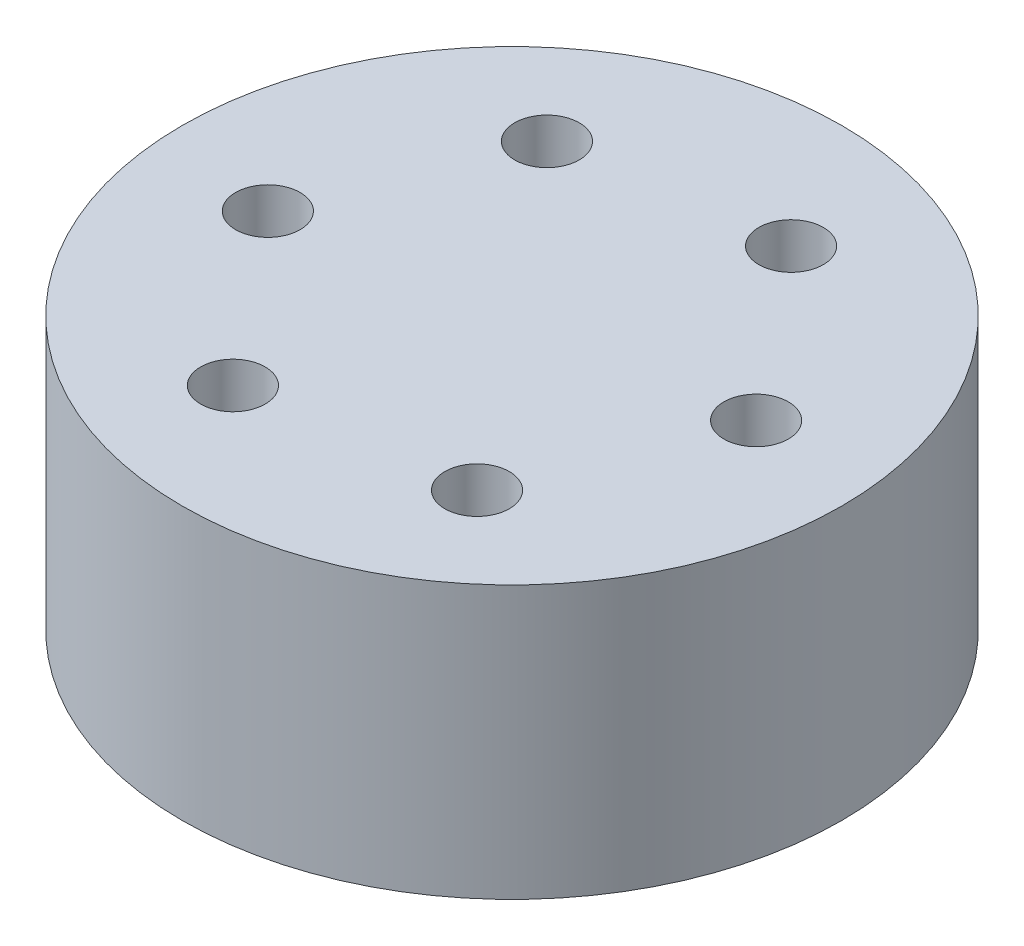
ISO-10303-21;
HEADER;
FILE_DESCRIPTION(('STEP AP214'),'2;1');
FILE_NAME('part.step','',(''),(''),'','','');
FILE_SCHEMA(('AUTOMOTIVE_DESIGN { 1 0 10303 214 1 1 1 1 }'));
ENDSEC;
DATA;
#1=APPLICATION_CONTEXT('core data for automotive mechanical design processes');
#2=APPLICATION_PROTOCOL_DEFINITION('international standard','automotive_design',2000,#1);
#3=PRODUCT_CONTEXT('',#1,'mechanical');
#4=PRODUCT('Part','Part','',(#3));
#5=PRODUCT_RELATED_PRODUCT_CATEGORY('part','',(#4));
#6=PRODUCT_DEFINITION_FORMATION('','',#4);
#7=PRODUCT_DEFINITION_CONTEXT('part definition',#1,'design');
#8=PRODUCT_DEFINITION('design','',#6,#7);
#9=PRODUCT_DEFINITION_SHAPE('','',#8);
#10=(LENGTH_UNIT() NAMED_UNIT(*) SI_UNIT(.MILLI.,.METRE.));
#11=(NAMED_UNIT(*) PLANE_ANGLE_UNIT() SI_UNIT($,.RADIAN.));
#12=(NAMED_UNIT(*) SI_UNIT($,.STERADIAN.) SOLID_ANGLE_UNIT());
#13=UNCERTAINTY_MEASURE_WITH_UNIT(LENGTH_MEASURE(1.E-05),#10,'distance_accuracy_value','');
#14=(GEOMETRIC_REPRESENTATION_CONTEXT(3) GLOBAL_UNCERTAINTY_ASSIGNED_CONTEXT((#13)) GLOBAL_UNIT_ASSIGNED_CONTEXT((#10,
#11,#12)) REPRESENTATION_CONTEXT('',''));
#15=CARTESIAN_POINT('',(0.,0.,0.));
#16=DIRECTION('',(0.,0.,1.));
#17=DIRECTION('',(1.,0.,0.));
#18=AXIS2_PLACEMENT_3D('',#15,#16,#17);
#19=CARTESIAN_POINT('',(0.,46.75,170.));
#20=DIRECTION('',(0.,-1.,0.));
#21=DIRECTION('',(0.,0.,-1.));
#22=AXIS2_PLACEMENT_3D('',#19,#20,#21);
#23=CYLINDRICAL_SURFACE('',#22,23.);
#24=CARTESIAN_POINT('',(0.,46.75,170.));
#25=DIRECTION('',(0.,1.,0.));
#26=DIRECTION('',(0.,0.,1.));
#27=AXIS2_PLACEMENT_3D('',#24,#25,#26);
#28=CIRCLE('',#27,23.);
#29=CARTESIAN_POINT('',(0.,46.75,193.));
#30=VERTEX_POINT('',#29);
#31=EDGE_CURVE('E10',#30,#30,#28,.T.);
#32=ORIENTED_EDGE('',*,*,#31,.F.);
#33=EDGE_LOOP('',(#32));
#34=FACE_BOUND('',#33,.T.);
#35=CARTESIAN_POINT('',(0.,27.75,170.));
#36=DIRECTION('',(0.,1.,0.));
#37=DIRECTION('',(0.,0.,1.));
#38=AXIS2_PLACEMENT_3D('',#35,#36,#37);
#39=CIRCLE('',#38,23.);
#40=CARTESIAN_POINT('',(0.,27.75,193.));
#41=VERTEX_POINT('',#40);
#42=EDGE_CURVE('E42',#41,#41,#39,.T.);
#43=ORIENTED_EDGE('',*,*,#42,.T.);
#44=EDGE_LOOP('',(#43));
#45=FACE_BOUND('',#44,.T.);
#46=ADVANCED_FACE('F40',(#34,#45),#23,.T.);
#47=CARTESIAN_POINT('',(0.,46.75,170.));
#48=DIRECTION('',(0.,1.,0.));
#49=DIRECTION('',(0.,0.,1.));
#50=AXIS2_PLACEMENT_3D('',#47,#48,#49);
#51=PLANE('',#50);
#52=CARTESIAN_POINT('',(14.8390849944448,46.75,167.808754571564));
#53=DIRECTION('',(0.,1.,0.));
#54=DIRECTION('',(0.,0.,1.));
#55=AXIS2_PLACEMENT_3D('',#52,#53,#54);
#56=CIRCLE('',#55,2.25);
#57=CARTESIAN_POINT('',(14.8390849944448,46.75,170.058754571564));
#58=VERTEX_POINT('',#57);
#59=EDGE_CURVE('E47',#58,#58,#56,.T.);
#60=ORIENTED_EDGE('',*,*,#59,.F.);
#61=EDGE_LOOP('',(#60));
#62=FACE_BOUND('',#61,.T.);
#63=CARTESIAN_POINT('',(5.52186829027017,46.75,156.053352711676));
#64=DIRECTION('',(0.,1.,0.));
#65=DIRECTION('',(0.,0.,1.));
#66=AXIS2_PLACEMENT_3D('',#63,#64,#65);
#67=CIRCLE('',#66,2.25);
#68=CARTESIAN_POINT('',(5.52186829027017,46.75,158.303352711676));
#69=VERTEX_POINT('',#68);
#70=EDGE_CURVE('E92',#69,#69,#67,.T.);
#71=ORIENTED_EDGE('',*,*,#70,.F.);
#72=EDGE_LOOP('',(#71));
#73=FACE_BOUND('',#72,.T.);
#74=CARTESIAN_POINT('',(-9.31721670417466,46.75,158.244598140112));
#75=DIRECTION('',(0.,1.,0.));
#76=DIRECTION('',(0.,0.,1.));
#77=AXIS2_PLACEMENT_3D('',#74,#75,#76);
#78=CIRCLE('',#77,2.25);
#79=CARTESIAN_POINT('',(-9.31721670417466,46.75,160.494598140112));
#80=VERTEX_POINT('',#79);
#81=EDGE_CURVE('E55',#80,#80,#78,.T.);
#82=ORIENTED_EDGE('',*,*,#81,.F.);
#83=EDGE_LOOP('',(#82));
#84=FACE_BOUND('',#83,.T.);
#85=CARTESIAN_POINT('',(-14.8390849944448,46.75,172.191245428436));
#86=DIRECTION('',(0.,1.,0.));
#87=DIRECTION('',(0.,0.,1.));
#88=AXIS2_PLACEMENT_3D('',#85,#86,#87);
#89=CIRCLE('',#88,2.25);
#90=CARTESIAN_POINT('',(-14.8390849944448,46.75,174.441245428436));
#91=VERTEX_POINT('',#90);
#92=EDGE_CURVE('E101',#91,#91,#89,.T.);
#93=ORIENTED_EDGE('',*,*,#92,.F.);
#94=EDGE_LOOP('',(#93));
#95=FACE_BOUND('',#94,.T.);
#96=CARTESIAN_POINT('',(-5.52186829027017,46.75,183.946647288324));
#97=DIRECTION('',(0.,1.,0.));
#98=DIRECTION('',(0.,0.,1.));
#99=AXIS2_PLACEMENT_3D('',#96,#97,#98);
#100=CIRCLE('',#99,2.25);
#101=CARTESIAN_POINT('',(-5.52186829027017,46.75,186.196647288324));
#102=VERTEX_POINT('',#101);
#103=EDGE_CURVE('E103',#102,#102,#100,.T.);
#104=ORIENTED_EDGE('',*,*,#103,.F.);
#105=EDGE_LOOP('',(#104));
#106=FACE_BOUND('',#105,.T.);
#107=CARTESIAN_POINT('',(9.31721670417466,46.75,181.755401859888));
#108=DIRECTION('',(0.,1.,0.));
#109=DIRECTION('',(0.,0.,1.));
#110=AXIS2_PLACEMENT_3D('',#107,#108,#109);
#111=CIRCLE('',#110,2.25);
#112=CARTESIAN_POINT('',(9.31721670417466,46.75,184.005401859888));
#113=VERTEX_POINT('',#112);
#114=EDGE_CURVE('E98',#113,#113,#111,.T.);
#115=ORIENTED_EDGE('',*,*,#114,.F.);
#116=EDGE_LOOP('',(#115));
#117=FACE_BOUND('',#116,.T.);
#118=ORIENTED_EDGE('',*,*,#31,.T.);
#119=EDGE_LOOP('',(#118));
#120=FACE_BOUND('',#119,.T.);
#121=ADVANCED_FACE('F115',(#62,#73,#84,#95,#106,#117,#120),#51,.T.);
#122=CARTESIAN_POINT('',(0.,27.75,170.));
#123=DIRECTION('',(0.,1.,0.));
#124=DIRECTION('',(0.,0.,1.));
#125=AXIS2_PLACEMENT_3D('',#122,#123,#124);
#126=PLANE('',#125);
#127=CARTESIAN_POINT('',(0.,27.75,170.));
#128=DIRECTION('',(0.,1.,0.));
#129=DIRECTION('',(0.,0.,1.));
#130=AXIS2_PLACEMENT_3D('',#127,#128,#129);
#131=CIRCLE('',#130,21.2);
#132=CARTESIAN_POINT('',(0.,27.75,191.2));
#133=VERTEX_POINT('',#132);
#134=EDGE_CURVE('E67',#133,#133,#131,.T.);
#135=ORIENTED_EDGE('',*,*,#134,.T.);
#136=EDGE_LOOP('',(#135));
#137=FACE_BOUND('',#136,.T.);
#138=ORIENTED_EDGE('',*,*,#42,.F.);
#139=EDGE_LOOP('',(#138));
#140=FACE_BOUND('',#139,.T.);
#141=ADVANCED_FACE('F114',(#137,#140),#126,.F.);
#142=CARTESIAN_POINT('',(9.31721670417466,46.75,181.755401859888));
#143=DIRECTION('',(0.,-1.,0.));
#144=DIRECTION('',(0.,0.,-1.));
#145=AXIS2_PLACEMENT_3D('',#142,#143,#144);
#146=CYLINDRICAL_SURFACE('',#145,2.25);
#147=CARTESIAN_POINT('',(9.31721670417466,28.95,181.755401859888));
#148=DIRECTION('',(0.,1.,0.));
#149=DIRECTION('',(0.,0.,1.));
#150=AXIS2_PLACEMENT_3D('',#147,#148,#149);
#151=CIRCLE('',#150,2.25);
#152=CARTESIAN_POINT('',(9.31721670417466,28.95,184.005401859888));
#153=VERTEX_POINT('',#152);
#154=EDGE_CURVE('E89',#153,#153,#151,.T.);
#155=ORIENTED_EDGE('',*,*,#154,.F.);
#156=EDGE_LOOP('',(#155));
#157=FACE_BOUND('',#156,.T.);
#158=ORIENTED_EDGE('',*,*,#114,.T.);
#159=EDGE_LOOP('',(#158));
#160=FACE_BOUND('',#159,.T.);
#161=ADVANCED_FACE('F124',(#157,#160),#146,.F.);
#162=CARTESIAN_POINT('',(-5.52186829027017,46.75,183.946647288324));
#163=DIRECTION('',(0.,-1.,0.));
#164=DIRECTION('',(0.,0.,-1.));
#165=AXIS2_PLACEMENT_3D('',#162,#163,#164);
#166=CYLINDRICAL_SURFACE('',#165,2.25);
#167=CARTESIAN_POINT('',(-5.52186829027017,28.95,183.946647288324));
#168=DIRECTION('',(0.,1.,0.));
#169=DIRECTION('',(0.,0.,1.));
#170=AXIS2_PLACEMENT_3D('',#167,#168,#169);
#171=CIRCLE('',#170,2.25);
#172=CARTESIAN_POINT('',(-5.52186829027017,28.95,186.196647288324));
#173=VERTEX_POINT('',#172);
#174=EDGE_CURVE('E90',#173,#173,#171,.T.);
#175=ORIENTED_EDGE('',*,*,#174,.F.);
#176=EDGE_LOOP('',(#175));
#177=FACE_BOUND('',#176,.T.);
#178=ORIENTED_EDGE('',*,*,#103,.T.);
#179=EDGE_LOOP('',(#178));
#180=FACE_BOUND('',#179,.T.);
#181=ADVANCED_FACE('F123',(#177,#180),#166,.F.);
#182=CARTESIAN_POINT('',(-14.8390849944448,46.75,172.191245428436));
#183=DIRECTION('',(0.,-1.,0.));
#184=DIRECTION('',(0.,0.,-1.));
#185=AXIS2_PLACEMENT_3D('',#182,#183,#184);
#186=CYLINDRICAL_SURFACE('',#185,2.25);
#187=CARTESIAN_POINT('',(-14.8390849944448,28.95,172.191245428436));
#188=DIRECTION('',(0.,1.,0.));
#189=DIRECTION('',(0.,0.,1.));
#190=AXIS2_PLACEMENT_3D('',#187,#188,#189);
#191=CIRCLE('',#190,2.25);
#192=CARTESIAN_POINT('',(-14.8390849944448,28.95,174.441245428436));
#193=VERTEX_POINT('',#192);
#194=EDGE_CURVE('E81',#193,#193,#191,.T.);
#195=ORIENTED_EDGE('',*,*,#194,.F.);
#196=EDGE_LOOP('',(#195));
#197=FACE_BOUND('',#196,.T.);
#198=ORIENTED_EDGE('',*,*,#92,.T.);
#199=EDGE_LOOP('',(#198));
#200=FACE_BOUND('',#199,.T.);
#201=ADVANCED_FACE('F135',(#197,#200),#186,.F.);
#202=CARTESIAN_POINT('',(-9.31721670417466,46.75,158.244598140112));
#203=DIRECTION('',(0.,-1.,0.));
#204=DIRECTION('',(0.,0.,-1.));
#205=AXIS2_PLACEMENT_3D('',#202,#203,#204);
#206=CYLINDRICAL_SURFACE('',#205,2.25);
#207=CARTESIAN_POINT('',(-9.31721670417466,28.95,158.244598140112));
#208=DIRECTION('',(0.,1.,0.));
#209=DIRECTION('',(0.,0.,1.));
#210=AXIS2_PLACEMENT_3D('',#207,#208,#209);
#211=CIRCLE('',#210,2.25);
#212=CARTESIAN_POINT('',(-9.31721670417466,28.95,160.494598140112));
#213=VERTEX_POINT('',#212);
#214=EDGE_CURVE('E82',#213,#213,#211,.T.);
#215=ORIENTED_EDGE('',*,*,#214,.F.);
#216=EDGE_LOOP('',(#215));
#217=FACE_BOUND('',#216,.T.);
#218=ORIENTED_EDGE('',*,*,#81,.T.);
#219=EDGE_LOOP('',(#218));
#220=FACE_BOUND('',#219,.T.);
#221=ADVANCED_FACE('F109',(#217,#220),#206,.F.);
#222=CARTESIAN_POINT('',(5.52186829027017,46.75,156.053352711676));
#223=DIRECTION('',(0.,-1.,0.));
#224=DIRECTION('',(0.,0.,-1.));
#225=AXIS2_PLACEMENT_3D('',#222,#223,#224);
#226=CYLINDRICAL_SURFACE('',#225,2.25);
#227=CARTESIAN_POINT('',(5.52186829027017,28.95,156.053352711676));
#228=DIRECTION('',(0.,1.,0.));
#229=DIRECTION('',(0.,0.,1.));
#230=AXIS2_PLACEMENT_3D('',#227,#228,#229);
#231=CIRCLE('',#230,2.25);
#232=CARTESIAN_POINT('',(5.52186829027017,28.95,158.303352711676));
#233=VERTEX_POINT('',#232);
#234=EDGE_CURVE('E59',#233,#233,#231,.T.);
#235=ORIENTED_EDGE('',*,*,#234,.F.);
#236=EDGE_LOOP('',(#235));
#237=FACE_BOUND('',#236,.T.);
#238=ORIENTED_EDGE('',*,*,#70,.T.);
#239=EDGE_LOOP('',(#238));
#240=FACE_BOUND('',#239,.T.);
#241=ADVANCED_FACE('F182',(#237,#240),#226,.F.);
#242=CARTESIAN_POINT('',(14.8390849944448,46.75,167.808754571564));
#243=DIRECTION('',(0.,-1.,0.));
#244=DIRECTION('',(0.,0.,-1.));
#245=AXIS2_PLACEMENT_3D('',#242,#243,#244);
#246=CYLINDRICAL_SURFACE('',#245,2.25);
#247=CARTESIAN_POINT('',(14.8390849944448,28.95,167.808754571564));
#248=DIRECTION('',(0.,1.,0.));
#249=DIRECTION('',(0.,0.,1.));
#250=AXIS2_PLACEMENT_3D('',#247,#248,#249);
#251=CIRCLE('',#250,2.25);
#252=CARTESIAN_POINT('',(14.8390849944448,28.95,170.058754571564));
#253=VERTEX_POINT('',#252);
#254=EDGE_CURVE('E54',#253,#253,#251,.T.);
#255=ORIENTED_EDGE('',*,*,#254,.F.);
#256=EDGE_LOOP('',(#255));
#257=FACE_BOUND('',#256,.T.);
#258=ORIENTED_EDGE('',*,*,#59,.T.);
#259=EDGE_LOOP('',(#258));
#260=FACE_BOUND('',#259,.T.);
#261=ADVANCED_FACE('F194',(#257,#260),#246,.F.);
#262=CARTESIAN_POINT('',(0.,28.95,170.));
#263=DIRECTION('',(0.,-1.,0.));
#264=DIRECTION('',(0.,0.,-1.));
#265=AXIS2_PLACEMENT_3D('',#262,#263,#264);
#266=CYLINDRICAL_SURFACE('',#265,21.2);
#267=CARTESIAN_POINT('',(0.,28.95,170.));
#268=DIRECTION('',(0.,1.,0.));
#269=DIRECTION('',(0.,0.,1.));
#270=AXIS2_PLACEMENT_3D('',#267,#268,#269);
#271=CIRCLE('',#270,21.2);
#272=CARTESIAN_POINT('',(0.,28.95,191.2));
#273=VERTEX_POINT('',#272);
#274=EDGE_CURVE('E56',#273,#273,#271,.T.);
#275=ORIENTED_EDGE('',*,*,#274,.T.);
#276=EDGE_LOOP('',(#275));
#277=FACE_BOUND('',#276,.T.);
#278=ORIENTED_EDGE('',*,*,#134,.F.);
#279=EDGE_LOOP('',(#278));
#280=FACE_BOUND('',#279,.T.);
#281=ADVANCED_FACE('F205',(#277,#280),#266,.F.);
#282=CARTESIAN_POINT('',(0.,28.95,170.));
#283=DIRECTION('',(0.,1.,0.));
#284=DIRECTION('',(0.,0.,1.));
#285=AXIS2_PLACEMENT_3D('',#282,#283,#284);
#286=PLANE('',#285);
#287=CARTESIAN_POINT('',(13.295803748202,28.95,175.264181103391));
#288=DIRECTION('',(0.,1.,0.));
#289=DIRECTION('',(0.,0.,1.));
#290=AXIS2_PLACEMENT_3D('',#287,#288,#289);
#291=CIRCLE('',#290,2.6);
#292=CARTESIAN_POINT('',(13.295803748202,28.95,177.864181103391));
#293=VERTEX_POINT('',#292);
#294=EDGE_CURVE('E37',#293,#293,#291,.F.);
#295=ORIENTED_EDGE('',*,*,#294,.F.);
#296=EDGE_LOOP('',(#295));
#297=FACE_BOUND('',#296,.T.);
#298=CARTESIAN_POINT('',(-11.2068164397595,28.95,178.88241325798));
#299=DIRECTION('',(0.,1.,0.));
#300=DIRECTION('',(0.,0.,1.));
#301=AXIS2_PLACEMENT_3D('',#298,#299,#300);
#302=CIRCLE('',#301,2.6);
#303=CARTESIAN_POINT('',(-11.2068164397595,28.95,181.48241325798));
#304=VERTEX_POINT('',#303);
#305=EDGE_CURVE('E65',#304,#304,#302,.F.);
#306=ORIENTED_EDGE('',*,*,#305,.F.);
#307=EDGE_LOOP('',(#306));
#308=FACE_BOUND('',#307,.T.);
#309=CARTESIAN_POINT('',(-2.08898730844249,28.95,155.853405638629));
#310=DIRECTION('',(0.,1.,0.));
#311=DIRECTION('',(0.,0.,1.));
#312=AXIS2_PLACEMENT_3D('',#309,#310,#311);
#313=CIRCLE('',#312,2.6);
#314=CARTESIAN_POINT('',(-2.08898730844249,28.95,158.453405638629));
#315=VERTEX_POINT('',#314);
#316=EDGE_CURVE('E58',#315,#315,#313,.F.);
#317=ORIENTED_EDGE('',*,*,#316,.F.);
#318=EDGE_LOOP('',(#317));
#319=FACE_BOUND('',#318,.T.);
#320=ORIENTED_EDGE('',*,*,#154,.T.);
#321=EDGE_LOOP('',(#320));
#322=FACE_BOUND('',#321,.T.);
#323=ORIENTED_EDGE('',*,*,#174,.T.);
#324=EDGE_LOOP('',(#323));
#325=FACE_BOUND('',#324,.T.);
#326=ORIENTED_EDGE('',*,*,#194,.T.);
#327=EDGE_LOOP('',(#326));
#328=FACE_BOUND('',#327,.T.);
#329=ORIENTED_EDGE('',*,*,#214,.T.);
#330=EDGE_LOOP('',(#329));
#331=FACE_BOUND('',#330,.T.);
#332=ORIENTED_EDGE('',*,*,#234,.T.);
#333=EDGE_LOOP('',(#332));
#334=FACE_BOUND('',#333,.T.);
#335=ORIENTED_EDGE('',*,*,#254,.T.);
#336=EDGE_LOOP('',(#335));
#337=FACE_BOUND('',#336,.T.);
#338=ORIENTED_EDGE('',*,*,#274,.F.);
#339=EDGE_LOOP('',(#338));
#340=FACE_BOUND('',#339,.T.);
#341=ADVANCED_FACE('F215',(#297,#308,#319,#322,#325,#328,#331,#334,#337,#340),#286,.F.);
#342=CARTESIAN_POINT('',(-2.08898730844249,32.75,155.853405638629));
#343=DIRECTION('',(0.,-1.,0.));
#344=DIRECTION('',(0.,0.,-1.));
#345=AXIS2_PLACEMENT_3D('',#342,#343,#344);
#346=CYLINDRICAL_SURFACE('',#345,2.6);
#347=CARTESIAN_POINT('',(-2.08898730844249,32.75,155.853405638629));
#348=DIRECTION('',(0.,1.,0.));
#349=DIRECTION('',(0.,0.,1.));
#350=AXIS2_PLACEMENT_3D('',#347,#348,#349);
#351=CIRCLE('',#350,2.6);
#352=CARTESIAN_POINT('',(-2.08898730844249,32.75,158.453405638629));
#353=VERTEX_POINT('',#352);
#354=EDGE_CURVE('E289',#353,#353,#351,.T.);
#355=ORIENTED_EDGE('',*,*,#354,.T.);
#356=EDGE_LOOP('',(#355));
#357=FACE_BOUND('',#356,.T.);
#358=ORIENTED_EDGE('',*,*,#316,.T.);
#359=EDGE_LOOP('',(#358));
#360=FACE_BOUND('',#359,.T.);
#361=ADVANCED_FACE('F225',(#357,#360),#346,.F.);
#362=CARTESIAN_POINT('',(-2.08898730844249,32.75,155.853405638629));
#363=DIRECTION('',(0.,1.,0.));
#364=DIRECTION('',(0.,0.,1.));
#365=AXIS2_PLACEMENT_3D('',#362,#363,#364);
#366=PLANE('',#365);
#367=ORIENTED_EDGE('',*,*,#354,.F.);
#368=EDGE_LOOP('',(#367));
#369=FACE_BOUND('',#368,.T.);
#370=ADVANCED_FACE('F235',(#369),#366,.F.);
#371=CARTESIAN_POINT('',(-11.2068164397595,32.75,178.88241325798));
#372=DIRECTION('',(0.,-1.,0.));
#373=DIRECTION('',(0.,0.,-1.));
#374=AXIS2_PLACEMENT_3D('',#371,#372,#373);
#375=CYLINDRICAL_SURFACE('',#374,2.6);
#376=CARTESIAN_POINT('',(-11.2068164397595,32.75,178.88241325798));
#377=DIRECTION('',(0.,1.,0.));
#378=DIRECTION('',(0.,0.,1.));
#379=AXIS2_PLACEMENT_3D('',#376,#377,#378);
#380=CIRCLE('',#379,2.6);
#381=CARTESIAN_POINT('',(-11.2068164397595,32.75,181.48241325798));
#382=VERTEX_POINT('',#381);
#383=EDGE_CURVE('E290',#382,#382,#380,.T.);
#384=ORIENTED_EDGE('',*,*,#383,.T.);
#385=EDGE_LOOP('',(#384));
#386=FACE_BOUND('',#385,.T.);
#387=ORIENTED_EDGE('',*,*,#305,.T.);
#388=EDGE_LOOP('',(#387));
#389=FACE_BOUND('',#388,.T.);
#390=ADVANCED_FACE('F245',(#386,#389),#375,.F.);
#391=CARTESIAN_POINT('',(-11.2068164397595,32.75,178.88241325798));
#392=DIRECTION('',(0.,1.,0.));
#393=DIRECTION('',(0.,0.,1.));
#394=AXIS2_PLACEMENT_3D('',#391,#392,#393);
#395=PLANE('',#394);
#396=ORIENTED_EDGE('',*,*,#383,.F.);
#397=EDGE_LOOP('',(#396));
#398=FACE_BOUND('',#397,.T.);
#399=ADVANCED_FACE('F255',(#398),#395,.F.);
#400=CARTESIAN_POINT('',(13.295803748202,32.75,175.264181103391));
#401=DIRECTION('',(0.,-1.,0.));
#402=DIRECTION('',(0.,0.,-1.));
#403=AXIS2_PLACEMENT_3D('',#400,#401,#402);
#404=CYLINDRICAL_SURFACE('',#403,2.6);
#405=CARTESIAN_POINT('',(13.295803748202,32.75,175.264181103391));
#406=DIRECTION('',(0.,1.,0.));
#407=DIRECTION('',(0.,0.,1.));
#408=AXIS2_PLACEMENT_3D('',#405,#406,#407);
#409=CIRCLE('',#408,2.6);
#410=CARTESIAN_POINT('',(13.295803748202,32.75,177.864181103391));
#411=VERTEX_POINT('',#410);
#412=EDGE_CURVE('E64',#411,#411,#409,.T.);
#413=ORIENTED_EDGE('',*,*,#412,.T.);
#414=EDGE_LOOP('',(#413));
#415=FACE_BOUND('',#414,.T.);
#416=ORIENTED_EDGE('',*,*,#294,.T.);
#417=EDGE_LOOP('',(#416));
#418=FACE_BOUND('',#417,.T.);
#419=ADVANCED_FACE('F265',(#415,#418),#404,.F.);
#420=CARTESIAN_POINT('',(13.295803748202,32.75,175.264181103391));
#421=DIRECTION('',(0.,1.,0.));
#422=DIRECTION('',(0.,0.,1.));
#423=AXIS2_PLACEMENT_3D('',#420,#421,#422);
#424=PLANE('',#423);
#425=ORIENTED_EDGE('',*,*,#412,.F.);
#426=EDGE_LOOP('',(#425));
#427=FACE_BOUND('',#426,.T.);
#428=ADVANCED_FACE('F275',(#427),#424,.F.);
#429=CLOSED_SHELL('',(#46,#121,#141,#161,#181,#201,#221,#241,#261,#281,#341,#361,#370,#390,#399,
#419,#428));
#430=MANIFOLD_SOLID_BREP('B2',#429);
#431=ADVANCED_BREP_SHAPE_REPRESENTATION('',(#18,#430),#14);
#432=SHAPE_DEFINITION_REPRESENTATION(#9,#431);
ENDSEC;
END-ISO-10303-21;
